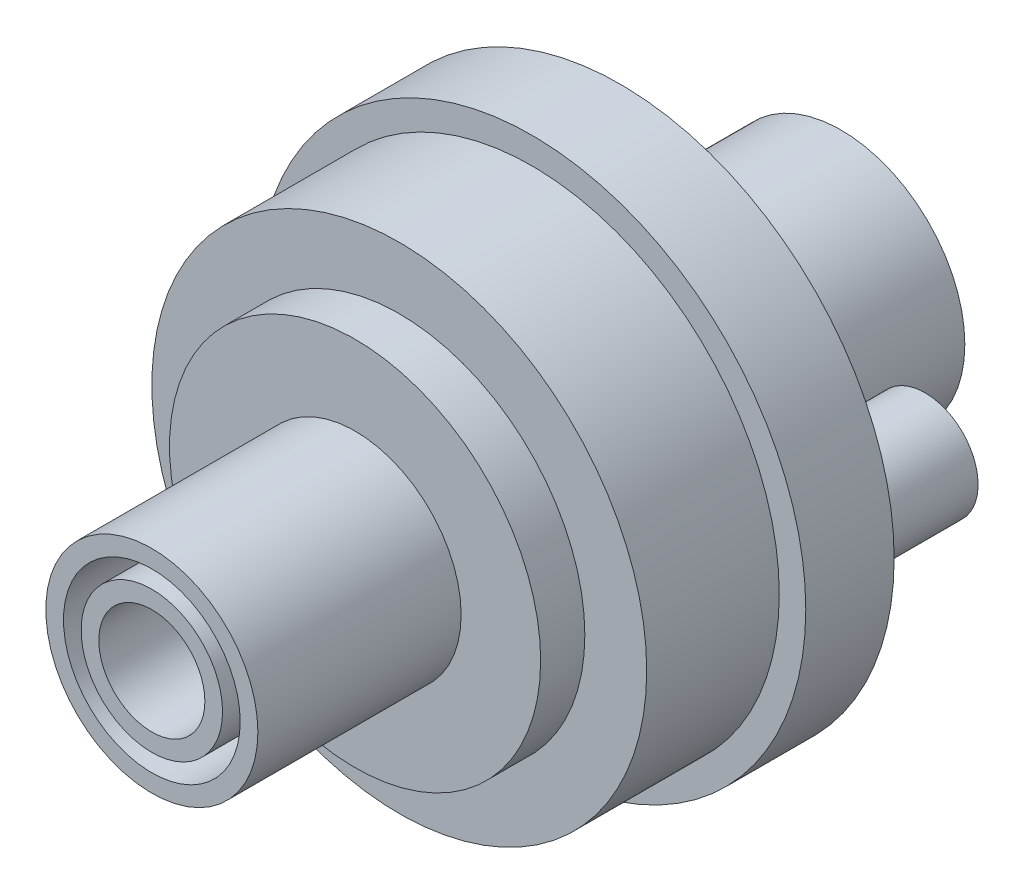
ISO-10303-21;
HEADER;
FILE_DESCRIPTION(('STEP AP214'),'2;1');
FILE_NAME('part.step','',(''),(''),'','','');
FILE_SCHEMA(('AUTOMOTIVE_DESIGN { 1 0 10303 214 1 1 1 1 }'));
ENDSEC;
DATA;
#1=APPLICATION_CONTEXT('core data for automotive mechanical design processes');
#2=APPLICATION_PROTOCOL_DEFINITION('international standard','automotive_design',2000,#1);
#3=PRODUCT_CONTEXT('',#1,'mechanical');
#4=PRODUCT('Part','Part','',(#3));
#5=PRODUCT_RELATED_PRODUCT_CATEGORY('part','',(#4));
#6=PRODUCT_DEFINITION_FORMATION('','',#4);
#7=PRODUCT_DEFINITION_CONTEXT('part definition',#1,'design');
#8=PRODUCT_DEFINITION('design','',#6,#7);
#9=PRODUCT_DEFINITION_SHAPE('','',#8);
#10=(LENGTH_UNIT() NAMED_UNIT(*) SI_UNIT(.MILLI.,.METRE.));
#11=(NAMED_UNIT(*) PLANE_ANGLE_UNIT() SI_UNIT($,.RADIAN.));
#12=(NAMED_UNIT(*) SI_UNIT($,.STERADIAN.) SOLID_ANGLE_UNIT());
#13=UNCERTAINTY_MEASURE_WITH_UNIT(LENGTH_MEASURE(1.E-05),#10,'distance_accuracy_value','');
#14=(GEOMETRIC_REPRESENTATION_CONTEXT(3) GLOBAL_UNCERTAINTY_ASSIGNED_CONTEXT((#13)) GLOBAL_UNIT_ASSIGNED_CONTEXT((#10,
#11,#12)) REPRESENTATION_CONTEXT('',''));
#15=CARTESIAN_POINT('',(0.,0.,0.));
#16=DIRECTION('',(0.,0.,1.));
#17=DIRECTION('',(1.,0.,0.));
#18=AXIS2_PLACEMENT_3D('',#15,#16,#17);
#19=CARTESIAN_POINT('',(-74.9571919441223,0.,15.1932640001178));
#20=DIRECTION('',(0.,0.,1.));
#21=DIRECTION('',(1.,0.,0.));
#22=AXIS2_PLACEMENT_3D('',#19,#20,#21);
#23=CYLINDRICAL_SURFACE('',#22,29.4862352311611);
#24=CARTESIAN_POINT('',(-74.9571919441223,0.,5.50287496298552));
#25=DIRECTION('',(0.,0.,1.));
#26=DIRECTION('',(1.,0.,0.));
#27=AXIS2_PLACEMENT_3D('',#24,#25,#26);
#28=CIRCLE('',#27,29.4862352311611);
#29=CARTESIAN_POINT('',(-45.4709567129612,0.,5.50287496298552));
#30=VERTEX_POINT('',#29);
#31=EDGE_CURVE('E10',#30,#30,#28,.T.);
#32=ORIENTED_EDGE('',*,*,#31,.T.);
#33=EDGE_LOOP('',(#32));
#34=FACE_BOUND('',#33,.T.);
#35=CARTESIAN_POINT('',(-74.9571919441223,0.,-1.04136508889496));
#36=DIRECTION('',(0.,0.,1.));
#37=DIRECTION('',(1.,0.,0.));
#38=AXIS2_PLACEMENT_3D('',#35,#36,#37);
#39=CIRCLE('',#38,29.4862352311611);
#40=CARTESIAN_POINT('',(-45.4709567129612,0.,-1.04136508889496));
#41=VERTEX_POINT('',#40);
#42=EDGE_CURVE('E21',#41,#41,#39,.T.);
#43=ORIENTED_EDGE('',*,*,#42,.F.);
#44=EDGE_LOOP('',(#43));
#45=FACE_BOUND('',#44,.T.);
#46=ADVANCED_FACE('F15',(#34,#45),#23,.F.);
#47=CARTESIAN_POINT('',(-57.7140743285417,0.,-1.04136508889496));
#48=DIRECTION('',(0.,0.,1.));
#49=DIRECTION('',(1.,0.,0.));
#50=AXIS2_PLACEMENT_3D('',#47,#48,#49);
#51=PLANE('',#50);
#52=ORIENTED_EDGE('',*,*,#42,.T.);
#53=EDGE_LOOP('',(#52));
#54=FACE_BOUND('',#53,.T.);
#55=CARTESIAN_POINT('',(-74.9571919441223,0.,-1.04136508889496));
#56=DIRECTION('',(0.,0.,1.));
#57=DIRECTION('',(1.,0.,0.));
#58=AXIS2_PLACEMENT_3D('',#55,#56,#57);
#59=CIRCLE('',#58,5.00000000000006);
#60=CARTESIAN_POINT('',(-69.9571919441222,0.,-1.04136508889496));
#61=VERTEX_POINT('',#60);
#62=EDGE_CURVE('E25',#61,#61,#59,.T.);
#63=ORIENTED_EDGE('',*,*,#62,.F.);
#64=EDGE_LOOP('',(#63));
#65=FACE_BOUND('',#64,.T.);
#66=ADVANCED_FACE('F271',(#54,#65),#51,.T.);
#67=CARTESIAN_POINT('',(-74.9571919441223,0.,15.1932640001178));
#68=DIRECTION('',(0.,0.,1.));
#69=DIRECTION('',(1.,0.,0.));
#70=AXIS2_PLACEMENT_3D('',#67,#68,#69);
#71=CYLINDRICAL_SURFACE('',#70,5.00000000000006);
#72=ORIENTED_EDGE('',*,*,#62,.T.);
#73=EDGE_LOOP('',(#72));
#74=FACE_BOUND('',#73,.T.);
#75=CARTESIAN_POINT('',(-74.9571919441223,0.,-28.015140414238));
#76=DIRECTION('',(0.,0.,1.));
#77=DIRECTION('',(1.,0.,0.));
#78=AXIS2_PLACEMENT_3D('',#75,#76,#77);
#79=CIRCLE('',#78,5.00000000000006);
#80=CARTESIAN_POINT('',(-69.9571919441222,0.,-28.015140414238));
#81=VERTEX_POINT('',#80);
#82=EDGE_CURVE('E29',#81,#81,#79,.T.);
#83=ORIENTED_EDGE('',*,*,#82,.F.);
#84=EDGE_LOOP('',(#83));
#85=FACE_BOUND('',#84,.T.);
#86=ADVANCED_FACE('F276',(#74,#85),#71,.F.);
#87=CARTESIAN_POINT('',(-68.9571919441223,0.,-28.015140414238));
#88=DIRECTION('',(0.,0.,-1.));
#89=DIRECTION('',(-1.,0.,0.));
#90=AXIS2_PLACEMENT_3D('',#87,#88,#89);
#91=PLANE('',#90);
#92=ORIENTED_EDGE('',*,*,#82,.T.);
#93=EDGE_LOOP('',(#92));
#94=FACE_BOUND('',#93,.T.);
#95=CARTESIAN_POINT('',(-74.9571919441223,0.,-28.015140414238));
#96=DIRECTION('',(0.,0.,1.));
#97=DIRECTION('',(1.,0.,0.));
#98=AXIS2_PLACEMENT_3D('',#95,#96,#97);
#99=CIRCLE('',#98,7.);
#100=CARTESIAN_POINT('',(-67.9571919441223,0.,-28.015140414238));
#101=VERTEX_POINT('',#100);
#102=EDGE_CURVE('E34',#101,#101,#99,.T.);
#103=ORIENTED_EDGE('',*,*,#102,.F.);
#104=EDGE_LOOP('',(#103));
#105=FACE_BOUND('',#104,.T.);
#106=ADVANCED_FACE('F281',(#94,#105),#91,.T.);
#107=CARTESIAN_POINT('',(-74.9571919441223,0.,15.1932640001178));
#108=DIRECTION('',(0.,0.,1.));
#109=DIRECTION('',(1.,0.,0.));
#110=AXIS2_PLACEMENT_3D('',#107,#108,#109);
#111=CYLINDRICAL_SURFACE('',#110,7.);
#112=ORIENTED_EDGE('',*,*,#102,.T.);
#113=EDGE_LOOP('',(#112));
#114=FACE_BOUND('',#113,.T.);
#115=CARTESIAN_POINT('',(-74.9571919441223,0.,-3.01514041423797));
#116=DIRECTION('',(0.,0.,1.));
#117=DIRECTION('',(1.,0.,0.));
#118=AXIS2_PLACEMENT_3D('',#115,#116,#117);
#119=CIRCLE('',#118,7.);
#120=CARTESIAN_POINT('',(-67.9571919441223,0.,-3.01514041423797));
#121=VERTEX_POINT('',#120);
#122=EDGE_CURVE('E37',#121,#121,#119,.T.);
#123=ORIENTED_EDGE('',*,*,#122,.F.);
#124=EDGE_LOOP('',(#123));
#125=FACE_BOUND('',#124,.T.);
#126=ADVANCED_FACE('F288',(#114,#125),#111,.T.);
#127=CARTESIAN_POINT('',(-65.4571919441223,0.,-3.01514041423797));
#128=DIRECTION('',(0.,0.,-1.));
#129=DIRECTION('',(-1.,0.,0.));
#130=AXIS2_PLACEMENT_3D('',#127,#128,#129);
#131=PLANE('',#130);
#132=ORIENTED_EDGE('',*,*,#122,.T.);
#133=EDGE_LOOP('',(#132));
#134=FACE_BOUND('',#133,.T.);
#135=CARTESIAN_POINT('',(-74.9571919441223,0.,-3.01514041423797));
#136=DIRECTION('',(0.,0.,1.));
#137=DIRECTION('',(1.,0.,0.));
#138=AXIS2_PLACEMENT_3D('',#135,#136,#137);
#139=CIRCLE('',#138,12.);
#140=CARTESIAN_POINT('',(-62.9571919441223,0.,-3.01514041423797));
#141=VERTEX_POINT('',#140);
#142=EDGE_CURVE('E40',#141,#141,#139,.T.);
#143=ORIENTED_EDGE('',*,*,#142,.F.);
#144=EDGE_LOOP('',(#143));
#145=FACE_BOUND('',#144,.T.);
#146=ADVANCED_FACE('F292',(#134,#145),#131,.T.);
#147=CARTESIAN_POINT('',(-74.9571919441223,0.,15.1932640001178));
#148=DIRECTION('',(0.,0.,1.));
#149=DIRECTION('',(1.,0.,0.));
#150=AXIS2_PLACEMENT_3D('',#147,#148,#149);
#151=CYLINDRICAL_SURFACE('',#150,12.);
#152=ORIENTED_EDGE('',*,*,#142,.T.);
#153=EDGE_LOOP('',(#152));
#154=FACE_BOUND('',#153,.T.);
#155=CARTESIAN_POINT('',(-74.9571919441223,0.,-28.015140414238));
#156=DIRECTION('',(0.,0.,1.));
#157=DIRECTION('',(1.,0.,0.));
#158=AXIS2_PLACEMENT_3D('',#155,#156,#157);
#159=CIRCLE('',#158,12.);
#160=CARTESIAN_POINT('',(-62.9571919441223,0.,-28.015140414238));
#161=VERTEX_POINT('',#160);
#162=EDGE_CURVE('E43',#161,#161,#159,.T.);
#163=ORIENTED_EDGE('',*,*,#162,.F.);
#164=EDGE_LOOP('',(#163));
#165=FACE_BOUND('',#164,.T.);
#166=ADVANCED_FACE('F296',(#154,#165),#151,.F.);
#167=CARTESIAN_POINT('',(-61.9571919441223,0.,-28.015140414238));
#168=DIRECTION('',(0.,0.,-1.));
#169=DIRECTION('',(-1.,0.,0.));
#170=AXIS2_PLACEMENT_3D('',#167,#168,#169);
#171=PLANE('',#170);
#172=ORIENTED_EDGE('',*,*,#162,.T.);
#173=EDGE_LOOP('',(#172));
#174=FACE_BOUND('',#173,.T.);
#175=CARTESIAN_POINT('',(-74.9571919441223,0.,-28.015140414238));
#176=DIRECTION('',(0.,0.,1.));
#177=DIRECTION('',(1.,0.,0.));
#178=AXIS2_PLACEMENT_3D('',#175,#176,#177);
#179=CIRCLE('',#178,14.);
#180=CARTESIAN_POINT('',(-60.9571919441223,0.,-28.015140414238));
#181=VERTEX_POINT('',#180);
#182=EDGE_CURVE('E46',#181,#181,#179,.T.);
#183=ORIENTED_EDGE('',*,*,#182,.F.);
#184=EDGE_LOOP('',(#183));
#185=FACE_BOUND('',#184,.T.);
#186=ADVANCED_FACE('F300',(#174,#185),#171,.T.);
#187=CARTESIAN_POINT('',(-74.9571919441223,0.,15.1932640001178));
#188=DIRECTION('',(0.,0.,1.));
#189=DIRECTION('',(1.,0.,0.));
#190=AXIS2_PLACEMENT_3D('',#187,#188,#189);
#191=CYLINDRICAL_SURFACE('',#190,14.);
#192=ORIENTED_EDGE('',*,*,#182,.T.);
#193=EDGE_LOOP('',(#192));
#194=FACE_BOUND('',#193,.T.);
#195=CARTESIAN_POINT('',(-74.9571919441223,0.,-3.01514041423797));
#196=DIRECTION('',(0.,0.,1.));
#197=DIRECTION('',(1.,0.,0.));
#198=AXIS2_PLACEMENT_3D('',#195,#196,#197);
#199=CIRCLE('',#198,14.);
#200=CARTESIAN_POINT('',(-60.9571919441223,0.,-3.01514041423797));
#201=VERTEX_POINT('',#200);
#202=EDGE_CURVE('E49',#201,#201,#199,.T.);
#203=ORIENTED_EDGE('',*,*,#202,.F.);
#204=EDGE_LOOP('',(#203));
#205=FACE_BOUND('',#204,.T.);
#206=ADVANCED_FACE('F138',(#194,#205),#191,.T.);
#207=CARTESIAN_POINT('',(-52.4571919441223,0.,-3.01514041423797));
#208=DIRECTION('',(0.,0.,-1.));
#209=DIRECTION('',(-1.,0.,0.));
#210=AXIS2_PLACEMENT_3D('',#207,#208,#209);
#211=PLANE('',#210);
#212=CARTESIAN_POINT('',(-52.4571919441223,0.,-3.01514041423797));
#213=DIRECTION('',(0.,0.,-1.));
#214=DIRECTION('',(-1.,0.,0.));
#215=AXIS2_PLACEMENT_3D('',#212,#213,#214);
#216=CIRCLE('',#215,6.);
#217=CARTESIAN_POINT('',(-58.4571919441223,0.,-3.01514041423797));
#218=VERTEX_POINT('',#217);
#219=EDGE_CURVE('E52',#218,#218,#216,.T.);
#220=ORIENTED_EDGE('',*,*,#219,.F.);
#221=EDGE_LOOP('',(#220));
#222=FACE_BOUND('',#221,.T.);
#223=CARTESIAN_POINT('',(-96.2749570608139,0.,-3.01514041423797));
#224=DIRECTION('',(0.,0.,-1.));
#225=DIRECTION('',(-1.,0.,0.));
#226=AXIS2_PLACEMENT_3D('',#223,#224,#225);
#227=CIRCLE('',#226,6.);
#228=CARTESIAN_POINT('',(-102.274957060814,0.,-3.01514041423797));
#229=VERTEX_POINT('',#228);
#230=EDGE_CURVE('E55',#229,#229,#227,.T.);
#231=ORIENTED_EDGE('',*,*,#230,.F.);
#232=EDGE_LOOP('',(#231));
#233=FACE_BOUND('',#232,.T.);
#234=ORIENTED_EDGE('',*,*,#202,.T.);
#235=EDGE_LOOP('',(#234));
#236=FACE_BOUND('',#235,.T.);
#237=CARTESIAN_POINT('',(-74.9571919441223,0.,-3.01514041423797));
#238=DIRECTION('',(0.,0.,1.));
#239=DIRECTION('',(1.,0.,0.));
#240=AXIS2_PLACEMENT_3D('',#237,#238,#239);
#241=CIRCLE('',#240,31.);
#242=CARTESIAN_POINT('',(-43.9571919441223,0.,-3.01514041423797));
#243=VERTEX_POINT('',#242);
#244=EDGE_CURVE('E58',#243,#243,#241,.T.);
#245=ORIENTED_EDGE('',*,*,#244,.F.);
#246=EDGE_LOOP('',(#245));
#247=FACE_BOUND('',#246,.T.);
#248=ADVANCED_FACE('F134',(#222,#233,#236,#247),#211,.T.);
#249=CARTESIAN_POINT('',(-74.9571919441223,0.,15.1932640001178));
#250=DIRECTION('',(0.,0.,1.));
#251=DIRECTION('',(1.,0.,0.));
#252=AXIS2_PLACEMENT_3D('',#249,#250,#251);
#253=CYLINDRICAL_SURFACE('',#252,31.);
#254=ORIENTED_EDGE('',*,*,#244,.T.);
#255=EDGE_LOOP('',(#254));
#256=FACE_BOUND('',#255,.T.);
#257=CARTESIAN_POINT('',(-74.9571919441223,0.,6.98485958576203));
#258=DIRECTION('',(0.,0.,1.));
#259=DIRECTION('',(1.,0.,0.));
#260=AXIS2_PLACEMENT_3D('',#257,#258,#259);
#261=CIRCLE('',#260,31.);
#262=CARTESIAN_POINT('',(-43.9571919441223,0.,6.98485958576203));
#263=VERTEX_POINT('',#262);
#264=EDGE_CURVE('E61',#263,#263,#261,.T.);
#265=ORIENTED_EDGE('',*,*,#264,.F.);
#266=EDGE_LOOP('',(#265));
#267=FACE_BOUND('',#266,.T.);
#268=ADVANCED_FACE('F137',(#256,#267),#253,.T.);
#269=CARTESIAN_POINT('',(-45.4571919441223,0.,6.98485958576203));
#270=DIRECTION('',(0.,0.,1.));
#271=DIRECTION('',(1.,0.,0.));
#272=AXIS2_PLACEMENT_3D('',#269,#270,#271);
#273=PLANE('',#272);
#274=ORIENTED_EDGE('',*,*,#264,.T.);
#275=EDGE_LOOP('',(#274));
#276=FACE_BOUND('',#275,.T.);
#277=CARTESIAN_POINT('',(-74.9571919441223,0.,6.98485958576203));
#278=DIRECTION('',(0.,0.,1.));
#279=DIRECTION('',(1.,0.,0.));
#280=AXIS2_PLACEMENT_3D('',#277,#278,#279);
#281=CIRCLE('',#280,28.);
#282=CARTESIAN_POINT('',(-46.9571919441223,0.,6.98485958576203));
#283=VERTEX_POINT('',#282);
#284=EDGE_CURVE('E64',#283,#283,#281,.T.);
#285=ORIENTED_EDGE('',*,*,#284,.F.);
#286=EDGE_LOOP('',(#285));
#287=FACE_BOUND('',#286,.T.);
#288=ADVANCED_FACE('F148',(#276,#287),#273,.T.);
#289=CARTESIAN_POINT('',(-74.9571919441223,0.,15.1932640001178));
#290=DIRECTION('',(0.,0.,1.));
#291=DIRECTION('',(1.,0.,0.));
#292=AXIS2_PLACEMENT_3D('',#289,#290,#291);
#293=CYLINDRICAL_SURFACE('',#292,28.);
#294=ORIENTED_EDGE('',*,*,#284,.T.);
#295=EDGE_LOOP('',(#294));
#296=FACE_BOUND('',#295,.T.);
#297=CARTESIAN_POINT('',(-74.9571919441223,0.,21.984859585762));
#298=DIRECTION('',(0.,0.,1.));
#299=DIRECTION('',(1.,0.,0.));
#300=AXIS2_PLACEMENT_3D('',#297,#298,#299);
#301=CIRCLE('',#300,28.);
#302=CARTESIAN_POINT('',(-46.9571919441223,0.,21.984859585762));
#303=VERTEX_POINT('',#302);
#304=EDGE_CURVE('E67',#303,#303,#301,.T.);
#305=ORIENTED_EDGE('',*,*,#304,.F.);
#306=EDGE_LOOP('',(#305));
#307=FACE_BOUND('',#306,.T.);
#308=ADVANCED_FACE('F154',(#296,#307),#293,.T.);
#309=CARTESIAN_POINT('',(-50.4571919441223,0.,21.984859585762));
#310=DIRECTION('',(0.,0.,1.));
#311=DIRECTION('',(1.,0.,0.));
#312=AXIS2_PLACEMENT_3D('',#309,#310,#311);
#313=PLANE('',#312);
#314=ORIENTED_EDGE('',*,*,#304,.T.);
#315=EDGE_LOOP('',(#314));
#316=FACE_BOUND('',#315,.T.);
#317=CARTESIAN_POINT('',(-74.9571919441223,0.,21.984859585762));
#318=DIRECTION('',(0.,0.,1.));
#319=DIRECTION('',(1.,0.,0.));
#320=AXIS2_PLACEMENT_3D('',#317,#318,#319);
#321=CIRCLE('',#320,21.);
#322=CARTESIAN_POINT('',(-53.9571919441223,0.,21.984859585762));
#323=VERTEX_POINT('',#322);
#324=EDGE_CURVE('E70',#323,#323,#321,.T.);
#325=ORIENTED_EDGE('',*,*,#324,.F.);
#326=EDGE_LOOP('',(#325));
#327=FACE_BOUND('',#326,.T.);
#328=ADVANCED_FACE('F160',(#316,#327),#313,.T.);
#329=CARTESIAN_POINT('',(-74.9571919441223,0.,15.1932640001178));
#330=DIRECTION('',(0.,0.,1.));
#331=DIRECTION('',(1.,0.,0.));
#332=AXIS2_PLACEMENT_3D('',#329,#330,#331);
#333=CYLINDRICAL_SURFACE('',#332,21.);
#334=ORIENTED_EDGE('',*,*,#324,.T.);
#335=EDGE_LOOP('',(#334));
#336=FACE_BOUND('',#335,.T.);
#337=CARTESIAN_POINT('',(-74.9571919441223,0.,26.984859585762));
#338=DIRECTION('',(0.,0.,1.));
#339=DIRECTION('',(1.,0.,0.));
#340=AXIS2_PLACEMENT_3D('',#337,#338,#339);
#341=CIRCLE('',#340,21.);
#342=CARTESIAN_POINT('',(-53.9571919441223,0.,26.984859585762));
#343=VERTEX_POINT('',#342);
#344=EDGE_CURVE('E73',#343,#343,#341,.T.);
#345=ORIENTED_EDGE('',*,*,#344,.F.);
#346=EDGE_LOOP('',(#345));
#347=FACE_BOUND('',#346,.T.);
#348=ADVANCED_FACE('F166',(#336,#347),#333,.T.);
#349=CARTESIAN_POINT('',(-58.4571919441223,0.,26.984859585762));
#350=DIRECTION('',(0.,0.,1.));
#351=DIRECTION('',(1.,0.,0.));
#352=AXIS2_PLACEMENT_3D('',#349,#350,#351);
#353=PLANE('',#352);
#354=ORIENTED_EDGE('',*,*,#344,.T.);
#355=EDGE_LOOP('',(#354));
#356=FACE_BOUND('',#355,.T.);
#357=CARTESIAN_POINT('',(-74.9571919441223,0.,26.984859585762));
#358=DIRECTION('',(0.,0.,1.));
#359=DIRECTION('',(1.,0.,0.));
#360=AXIS2_PLACEMENT_3D('',#357,#358,#359);
#361=CIRCLE('',#360,12.);
#362=CARTESIAN_POINT('',(-62.9571919441223,0.,26.984859585762));
#363=VERTEX_POINT('',#362);
#364=EDGE_CURVE('E76',#363,#363,#361,.T.);
#365=ORIENTED_EDGE('',*,*,#364,.F.);
#366=EDGE_LOOP('',(#365));
#367=FACE_BOUND('',#366,.T.);
#368=ADVANCED_FACE('F172',(#356,#367),#353,.T.);
#369=CARTESIAN_POINT('',(-74.9571919441223,0.,15.1932640001178));
#370=DIRECTION('',(0.,0.,1.));
#371=DIRECTION('',(1.,0.,0.));
#372=AXIS2_PLACEMENT_3D('',#369,#370,#371);
#373=CYLINDRICAL_SURFACE('',#372,12.);
#374=ORIENTED_EDGE('',*,*,#364,.T.);
#375=EDGE_LOOP('',(#374));
#376=FACE_BOUND('',#375,.T.);
#377=CARTESIAN_POINT('',(-74.9571919441223,0.,49.984859585762));
#378=DIRECTION('',(0.,0.,1.));
#379=DIRECTION('',(1.,0.,0.));
#380=AXIS2_PLACEMENT_3D('',#377,#378,#379);
#381=CIRCLE('',#380,12.);
#382=CARTESIAN_POINT('',(-62.9571919441223,0.,49.984859585762));
#383=VERTEX_POINT('',#382);
#384=EDGE_CURVE('E79',#383,#383,#381,.T.);
#385=ORIENTED_EDGE('',*,*,#384,.F.);
#386=EDGE_LOOP('',(#385));
#387=FACE_BOUND('',#386,.T.);
#388=ADVANCED_FACE('F178',(#376,#387),#373,.T.);
#389=CARTESIAN_POINT('',(-63.9571919441223,0.,49.984859585762));
#390=DIRECTION('',(0.,0.,1.));
#391=DIRECTION('',(1.,0.,0.));
#392=AXIS2_PLACEMENT_3D('',#389,#390,#391);
#393=PLANE('',#392);
#394=ORIENTED_EDGE('',*,*,#384,.T.);
#395=EDGE_LOOP('',(#394));
#396=FACE_BOUND('',#395,.T.);
#397=CARTESIAN_POINT('',(-74.9571919441223,0.,49.984859585762));
#398=DIRECTION('',(0.,0.,1.));
#399=DIRECTION('',(1.,0.,0.));
#400=AXIS2_PLACEMENT_3D('',#397,#398,#399);
#401=CIRCLE('',#400,10.);
#402=CARTESIAN_POINT('',(-64.9571919441223,0.,49.984859585762));
#403=VERTEX_POINT('',#402);
#404=EDGE_CURVE('E82',#403,#403,#401,.T.);
#405=ORIENTED_EDGE('',*,*,#404,.F.);
#406=EDGE_LOOP('',(#405));
#407=FACE_BOUND('',#406,.T.);
#408=ADVANCED_FACE('F184',(#396,#407),#393,.T.);
#409=CARTESIAN_POINT('',(-74.9571919441223,0.,15.1932640001178));
#410=DIRECTION('',(0.,0.,1.));
#411=DIRECTION('',(1.,0.,0.));
#412=AXIS2_PLACEMENT_3D('',#409,#410,#411);
#413=CYLINDRICAL_SURFACE('',#412,10.);
#414=ORIENTED_EDGE('',*,*,#404,.T.);
#415=EDGE_LOOP('',(#414));
#416=FACE_BOUND('',#415,.T.);
#417=CARTESIAN_POINT('',(-74.9571919441223,0.,28.9848595857621));
#418=DIRECTION('',(0.,0.,1.));
#419=DIRECTION('',(1.,0.,0.));
#420=AXIS2_PLACEMENT_3D('',#417,#418,#419);
#421=CIRCLE('',#420,10.);
#422=CARTESIAN_POINT('',(-64.9571919441223,0.,28.9848595857621));
#423=VERTEX_POINT('',#422);
#424=EDGE_CURVE('E85',#423,#423,#421,.T.);
#425=ORIENTED_EDGE('',*,*,#424,.F.);
#426=EDGE_LOOP('',(#425));
#427=FACE_BOUND('',#426,.T.);
#428=ADVANCED_FACE('F190',(#416,#427),#413,.F.);
#429=CARTESIAN_POINT('',(-65.9571919441223,0.,28.9848595857621));
#430=DIRECTION('',(0.,0.,1.));
#431=DIRECTION('',(1.,0.,0.));
#432=AXIS2_PLACEMENT_3D('',#429,#430,#431);
#433=PLANE('',#432);
#434=ORIENTED_EDGE('',*,*,#424,.T.);
#435=EDGE_LOOP('',(#434));
#436=FACE_BOUND('',#435,.T.);
#437=CARTESIAN_POINT('',(-74.9571919441223,0.,28.9848595857621));
#438=DIRECTION('',(0.,0.,1.));
#439=DIRECTION('',(1.,0.,0.));
#440=AXIS2_PLACEMENT_3D('',#437,#438,#439);
#441=CIRCLE('',#440,8.);
#442=CARTESIAN_POINT('',(-66.9571919441223,0.,28.9848595857621));
#443=VERTEX_POINT('',#442);
#444=EDGE_CURVE('E88',#443,#443,#441,.T.);
#445=ORIENTED_EDGE('',*,*,#444,.F.);
#446=EDGE_LOOP('',(#445));
#447=FACE_BOUND('',#446,.T.);
#448=ADVANCED_FACE('F196',(#436,#447),#433,.T.);
#449=CARTESIAN_POINT('',(-74.9571919441223,0.,15.1932640001178));
#450=DIRECTION('',(0.,0.,1.));
#451=DIRECTION('',(1.,0.,0.));
#452=AXIS2_PLACEMENT_3D('',#449,#450,#451);
#453=CYLINDRICAL_SURFACE('',#452,8.);
#454=ORIENTED_EDGE('',*,*,#444,.T.);
#455=EDGE_LOOP('',(#454));
#456=FACE_BOUND('',#455,.T.);
#457=CARTESIAN_POINT('',(-74.9571919441223,0.,49.984859585762));
#458=DIRECTION('',(0.,0.,1.));
#459=DIRECTION('',(1.,0.,0.));
#460=AXIS2_PLACEMENT_3D('',#457,#458,#459);
#461=CIRCLE('',#460,8.);
#462=CARTESIAN_POINT('',(-66.9571919441223,0.,49.984859585762));
#463=VERTEX_POINT('',#462);
#464=EDGE_CURVE('E91',#463,#463,#461,.T.);
#465=ORIENTED_EDGE('',*,*,#464,.F.);
#466=EDGE_LOOP('',(#465));
#467=FACE_BOUND('',#466,.T.);
#468=ADVANCED_FACE('F202',(#456,#467),#453,.T.);
#469=CARTESIAN_POINT('',(-67.9571919441223,0.,49.984859585762));
#470=DIRECTION('',(0.,0.,1.));
#471=DIRECTION('',(1.,0.,0.));
#472=AXIS2_PLACEMENT_3D('',#469,#470,#471);
#473=PLANE('',#472);
#474=ORIENTED_EDGE('',*,*,#464,.T.);
#475=EDGE_LOOP('',(#474));
#476=FACE_BOUND('',#475,.T.);
#477=CARTESIAN_POINT('',(-74.9571919441223,0.,49.984859585762));
#478=DIRECTION('',(0.,0.,1.));
#479=DIRECTION('',(1.,0.,0.));
#480=AXIS2_PLACEMENT_3D('',#477,#478,#479);
#481=CIRCLE('',#480,6.);
#482=CARTESIAN_POINT('',(-68.9571919441223,0.,49.984859585762));
#483=VERTEX_POINT('',#482);
#484=EDGE_CURVE('E94',#483,#483,#481,.T.);
#485=ORIENTED_EDGE('',*,*,#484,.F.);
#486=EDGE_LOOP('',(#485));
#487=FACE_BOUND('',#486,.T.);
#488=ADVANCED_FACE('F208',(#476,#487),#473,.T.);
#489=CARTESIAN_POINT('',(-74.9571919441223,0.,15.1932640001178));
#490=DIRECTION('',(0.,0.,1.));
#491=DIRECTION('',(1.,0.,0.));
#492=AXIS2_PLACEMENT_3D('',#489,#490,#491);
#493=CYLINDRICAL_SURFACE('',#492,6.);
#494=ORIENTED_EDGE('',*,*,#484,.T.);
#495=EDGE_LOOP('',(#494));
#496=FACE_BOUND('',#495,.T.);
#497=CARTESIAN_POINT('',(-74.9571919441223,0.,28.100948780775));
#498=DIRECTION('',(0.,0.,1.));
#499=DIRECTION('',(1.,0.,0.));
#500=AXIS2_PLACEMENT_3D('',#497,#498,#499);
#501=CIRCLE('',#500,6.);
#502=CARTESIAN_POINT('',(-68.9571919441223,0.,28.100948780775));
#503=VERTEX_POINT('',#502);
#504=EDGE_CURVE('E97',#503,#503,#501,.T.);
#505=ORIENTED_EDGE('',*,*,#504,.F.);
#506=EDGE_LOOP('',(#505));
#507=FACE_BOUND('',#506,.T.);
#508=ADVANCED_FACE('F214',(#496,#507),#493,.F.);
#509=CARTESIAN_POINT('',(-66.5702917873859,0.,28.100948780775));
#510=DIRECTION('',(0.,0.,-1.));
#511=DIRECTION('',(-1.,0.,0.));
#512=AXIS2_PLACEMENT_3D('',#509,#510,#511);
#513=PLANE('',#512);
#514=ORIENTED_EDGE('',*,*,#504,.T.);
#515=EDGE_LOOP('',(#514));
#516=FACE_BOUND('',#515,.T.);
#517=CARTESIAN_POINT('',(-74.9571919441223,0.,28.100948780775));
#518=DIRECTION('',(0.,0.,1.));
#519=DIRECTION('',(1.,0.,0.));
#520=AXIS2_PLACEMENT_3D('',#517,#518,#519);
#521=CIRCLE('',#520,10.7738003134727);
#522=CARTESIAN_POINT('',(-64.1833916306496,0.,28.100948780775));
#523=VERTEX_POINT('',#522);
#524=EDGE_CURVE('E100',#523,#523,#521,.T.);
#525=ORIENTED_EDGE('',*,*,#524,.F.);
#526=EDGE_LOOP('',(#525));
#527=FACE_BOUND('',#526,.T.);
#528=ADVANCED_FACE('F220',(#516,#527),#513,.T.);
#529=CARTESIAN_POINT('',(-74.9571919441223,0.,15.1932640001178));
#530=DIRECTION('',(0.,0.,1.));
#531=DIRECTION('',(1.,0.,0.));
#532=AXIS2_PLACEMENT_3D('',#529,#530,#531);
#533=CYLINDRICAL_SURFACE('',#532,10.7738003134727);
#534=ORIENTED_EDGE('',*,*,#524,.T.);
#535=EDGE_LOOP('',(#534));
#536=FACE_BOUND('',#535,.T.);
#537=CARTESIAN_POINT('',(-74.9571919441223,0.,25.4423543810844));
#538=DIRECTION('',(0.,0.,1.));
#539=DIRECTION('',(1.,0.,0.));
#540=AXIS2_PLACEMENT_3D('',#537,#538,#539);
#541=CIRCLE('',#540,10.7738003134727);
#542=CARTESIAN_POINT('',(-64.1833916306496,0.,25.4423543810844));
#543=VERTEX_POINT('',#542);
#544=EDGE_CURVE('E103',#543,#543,#541,.T.);
#545=ORIENTED_EDGE('',*,*,#544,.F.);
#546=EDGE_LOOP('',(#545));
#547=FACE_BOUND('',#546,.T.);
#548=ADVANCED_FACE('F226',(#536,#547),#533,.F.);
#549=CARTESIAN_POINT('',(-59.8376076668501,0.,25.4423543810844));
#550=DIRECTION('',(0.,0.,-1.));
#551=DIRECTION('',(-1.,0.,0.));
#552=AXIS2_PLACEMENT_3D('',#549,#550,#551);
#553=PLANE('',#552);
#554=ORIENTED_EDGE('',*,*,#544,.T.);
#555=EDGE_LOOP('',(#554));
#556=FACE_BOUND('',#555,.T.);
#557=CARTESIAN_POINT('',(-74.9571919441223,0.,25.4423543810844));
#558=DIRECTION('',(0.,0.,1.));
#559=DIRECTION('',(1.,0.,0.));
#560=AXIS2_PLACEMENT_3D('',#557,#558,#559);
#561=CIRCLE('',#560,19.4653682410717);
#562=CARTESIAN_POINT('',(-55.4918237030506,0.,25.4423543810844));
#563=VERTEX_POINT('',#562);
#564=EDGE_CURVE('E106',#563,#563,#561,.T.);
#565=ORIENTED_EDGE('',*,*,#564,.F.);
#566=EDGE_LOOP('',(#565));
#567=FACE_BOUND('',#566,.T.);
#568=ADVANCED_FACE('F232',(#556,#567),#553,.T.);
#569=CARTESIAN_POINT('',(-74.9571919441223,0.,15.1932640001178));
#570=DIRECTION('',(0.,0.,1.));
#571=DIRECTION('',(1.,0.,0.));
#572=AXIS2_PLACEMENT_3D('',#569,#570,#571);
#573=CYLINDRICAL_SURFACE('',#572,19.4653682410717);
#574=ORIENTED_EDGE('',*,*,#564,.T.);
#575=EDGE_LOOP('',(#574));
#576=FACE_BOUND('',#575,.T.);
#577=CARTESIAN_POINT('',(-74.9571919441223,0.,20.1251599937677));
#578=DIRECTION('',(0.,0.,1.));
#579=DIRECTION('',(1.,0.,0.));
#580=AXIS2_PLACEMENT_3D('',#577,#578,#579);
#581=CIRCLE('',#580,19.4653682410717);
#582=CARTESIAN_POINT('',(-55.4918237030506,0.,20.1251599937677));
#583=VERTEX_POINT('',#582);
#584=EDGE_CURVE('E109',#583,#583,#581,.T.);
#585=ORIENTED_EDGE('',*,*,#584,.F.);
#586=EDGE_LOOP('',(#585));
#587=FACE_BOUND('',#586,.T.);
#588=ADVANCED_FACE('F238',(#576,#587),#573,.F.);
#589=CARTESIAN_POINT('',(-51.9129447638989,0.,20.1251599937677));
#590=DIRECTION('',(0.,0.,-1.));
#591=DIRECTION('',(-1.,0.,0.));
#592=AXIS2_PLACEMENT_3D('',#589,#590,#591);
#593=PLANE('',#592);
#594=ORIENTED_EDGE('',*,*,#584,.T.);
#595=EDGE_LOOP('',(#594));
#596=FACE_BOUND('',#595,.T.);
#597=CARTESIAN_POINT('',(-74.9571919441223,0.,20.1251599937677));
#598=DIRECTION('',(0.,0.,1.));
#599=DIRECTION('',(1.,0.,0.));
#600=AXIS2_PLACEMENT_3D('',#597,#598,#599);
#601=CIRCLE('',#600,26.6231261193753);
#602=CARTESIAN_POINT('',(-48.3340658247471,0.,20.1251599937677));
#603=VERTEX_POINT('',#602);
#604=EDGE_CURVE('E112',#603,#603,#601,.T.);
#605=ORIENTED_EDGE('',*,*,#604,.F.);
#606=EDGE_LOOP('',(#605));
#607=FACE_BOUND('',#606,.T.);
#608=ADVANCED_FACE('F244',(#596,#607),#593,.T.);
#609=CARTESIAN_POINT('',(-74.9571919441223,0.,15.1932640001178));
#610=DIRECTION('',(0.,0.,1.));
#611=DIRECTION('',(1.,0.,0.));
#612=AXIS2_PLACEMENT_3D('',#609,#610,#611);
#613=CYLINDRICAL_SURFACE('',#612,26.6231261193753);
#614=ORIENTED_EDGE('',*,*,#604,.T.);
#615=EDGE_LOOP('',(#614));
#616=FACE_BOUND('',#615,.T.);
#617=CARTESIAN_POINT('',(-74.9571919441223,0.,5.50287496298552));
#618=DIRECTION('',(0.,0.,1.));
#619=DIRECTION('',(1.,0.,0.));
#620=AXIS2_PLACEMENT_3D('',#617,#618,#619);
#621=CIRCLE('',#620,26.6231261193753);
#622=CARTESIAN_POINT('',(-48.3340658247471,0.,5.50287496298552));
#623=VERTEX_POINT('',#622);
#624=EDGE_CURVE('E115',#623,#623,#621,.T.);
#625=ORIENTED_EDGE('',*,*,#624,.F.);
#626=EDGE_LOOP('',(#625));
#627=FACE_BOUND('',#626,.T.);
#628=ADVANCED_FACE('F250',(#616,#627),#613,.F.);
#629=CARTESIAN_POINT('',(-46.9025112688541,0.,5.50287496298552));
#630=DIRECTION('',(0.,0.,-1.));
#631=DIRECTION('',(-1.,0.,0.));
#632=AXIS2_PLACEMENT_3D('',#629,#630,#631);
#633=PLANE('',#632);
#634=ORIENTED_EDGE('',*,*,#624,.T.);
#635=EDGE_LOOP('',(#634));
#636=FACE_BOUND('',#635,.T.);
#637=ORIENTED_EDGE('',*,*,#31,.F.);
#638=EDGE_LOOP('',(#637));
#639=FACE_BOUND('',#638,.T.);
#640=ADVANCED_FACE('F256',(#636,#639),#633,.T.);
#641=CARTESIAN_POINT('',(-96.2749570608139,0.,-15.0151404142379));
#642=DIRECTION('',(0.,0.,1.));
#643=DIRECTION('',(1.,0.,0.));
#644=AXIS2_PLACEMENT_3D('',#641,#642,#643);
#645=CYLINDRICAL_SURFACE('',#644,6.);
#646=CARTESIAN_POINT('',(-96.2749570608139,0.,-15.0151404142379));
#647=DIRECTION('',(0.,0.,-1.));
#648=DIRECTION('',(-1.,0.,0.));
#649=AXIS2_PLACEMENT_3D('',#646,#647,#648);
#650=CIRCLE('',#649,6.);
#651=CARTESIAN_POINT('',(-102.274957060814,0.,-15.0151404142379));
#652=VERTEX_POINT('',#651);
#653=EDGE_CURVE('E118',#652,#652,#650,.T.);
#654=ORIENTED_EDGE('',*,*,#653,.F.);
#655=EDGE_LOOP('',(#654));
#656=FACE_BOUND('',#655,.T.);
#657=ORIENTED_EDGE('',*,*,#230,.T.);
#658=EDGE_LOOP('',(#657));
#659=FACE_BOUND('',#658,.T.);
#660=ADVANCED_FACE('F262',(#656,#659),#645,.T.);
#661=CARTESIAN_POINT('',(-74.9571919441223,0.,-15.0151404142379));
#662=DIRECTION('',(0.,0.,-1.));
#663=DIRECTION('',(1.,0.,0.));
#664=AXIS2_PLACEMENT_3D('',#661,#662,#663);
#665=PLANE('',#664);
#666=ORIENTED_EDGE('',*,*,#653,.T.);
#667=EDGE_LOOP('',(#666));
#668=FACE_BOUND('',#667,.T.);
#669=ADVANCED_FACE('F130',(#668),#665,.T.);
#670=CARTESIAN_POINT('',(-52.4571919441223,0.,-15.0151404142379));
#671=DIRECTION('',(0.,0.,1.));
#672=DIRECTION('',(1.,0.,0.));
#673=AXIS2_PLACEMENT_3D('',#670,#671,#672);
#674=CYLINDRICAL_SURFACE('',#673,6.);
#675=CARTESIAN_POINT('',(-52.4571919441223,0.,-15.0151404142379));
#676=DIRECTION('',(0.,0.,-1.));
#677=DIRECTION('',(-1.,0.,0.));
#678=AXIS2_PLACEMENT_3D('',#675,#676,#677);
#679=CIRCLE('',#678,6.);
#680=CARTESIAN_POINT('',(-58.4571919441223,0.,-15.0151404142379));
#681=VERTEX_POINT('',#680);
#682=EDGE_CURVE('E121',#681,#681,#679,.T.);
#683=ORIENTED_EDGE('',*,*,#682,.F.);
#684=EDGE_LOOP('',(#683));
#685=FACE_BOUND('',#684,.T.);
#686=ORIENTED_EDGE('',*,*,#219,.T.);
#687=EDGE_LOOP('',(#686));
#688=FACE_BOUND('',#687,.T.);
#689=ADVANCED_FACE('F127',(#685,#688),#674,.T.);
#690=CARTESIAN_POINT('',(-74.9571919441223,0.,-15.0151404142379));
#691=DIRECTION('',(0.,0.,-1.));
#692=DIRECTION('',(1.,0.,0.));
#693=AXIS2_PLACEMENT_3D('',#690,#691,#692);
#694=PLANE('',#693);
#695=ORIENTED_EDGE('',*,*,#682,.T.);
#696=EDGE_LOOP('',(#695));
#697=FACE_BOUND('',#696,.T.);
#698=ADVANCED_FACE('F125',(#697),#694,.T.);
#699=CLOSED_SHELL('',(#46,#66,#86,#106,#126,#146,#166,#186,#206,#248,#268,#288,#308,#328,#348,
#368,#388,#408,#428,#448,#468,#488,#508,#528,#548,#568,#588,#608,#628,#640,#660,#669,#689,#698));
#700=MANIFOLD_SOLID_BREP('B1',#699);
#701=ADVANCED_BREP_SHAPE_REPRESENTATION('',(#18,#700),#14);
#702=SHAPE_DEFINITION_REPRESENTATION(#9,#701);
ENDSEC;
END-ISO-10303-21;
